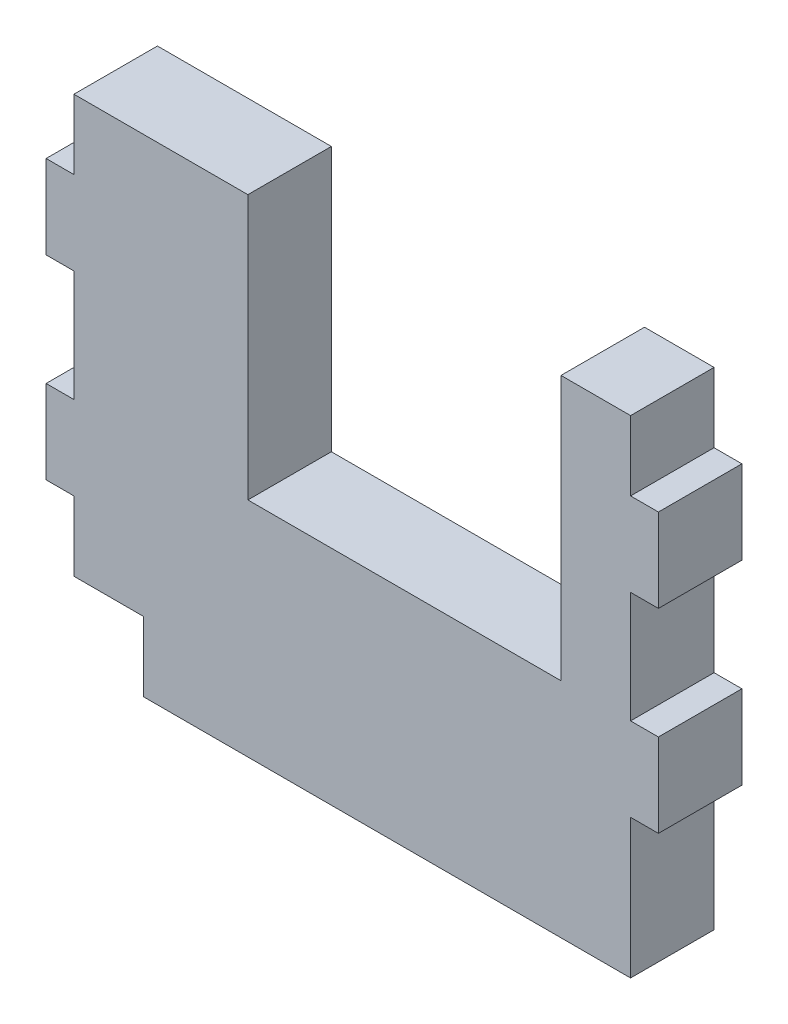
ISO-10303-21;
HEADER;
FILE_DESCRIPTION(('STEP AP214'),'2;1');
FILE_NAME('part.step','',(''),(''),'','','');
FILE_SCHEMA(('AUTOMOTIVE_DESIGN { 1 0 10303 214 1 1 1 1 }'));
ENDSEC;
DATA;
#1=APPLICATION_CONTEXT('core data for automotive mechanical design processes');
#2=APPLICATION_PROTOCOL_DEFINITION('international standard','automotive_design',2000,#1);
#3=PRODUCT_CONTEXT('',#1,'mechanical');
#4=PRODUCT('Part','Part','',(#3));
#5=PRODUCT_RELATED_PRODUCT_CATEGORY('part','',(#4));
#6=PRODUCT_DEFINITION_FORMATION('','',#4);
#7=PRODUCT_DEFINITION_CONTEXT('part definition',#1,'design');
#8=PRODUCT_DEFINITION('design','',#6,#7);
#9=PRODUCT_DEFINITION_SHAPE('','',#8);
#10=(LENGTH_UNIT() NAMED_UNIT(*) SI_UNIT(.MILLI.,.METRE.));
#11=(NAMED_UNIT(*) PLANE_ANGLE_UNIT() SI_UNIT($,.RADIAN.));
#12=(NAMED_UNIT(*) SI_UNIT($,.STERADIAN.) SOLID_ANGLE_UNIT());
#13=UNCERTAINTY_MEASURE_WITH_UNIT(LENGTH_MEASURE(1.E-05),#10,'distance_accuracy_value','');
#14=(GEOMETRIC_REPRESENTATION_CONTEXT(3) GLOBAL_UNCERTAINTY_ASSIGNED_CONTEXT((#13)) GLOBAL_UNIT_ASSIGNED_CONTEXT((#10,
#11,#12)) REPRESENTATION_CONTEXT('',''));
#15=CARTESIAN_POINT('',(0.,0.,0.));
#16=DIRECTION('',(0.,0.,1.));
#17=DIRECTION('',(1.,0.,0.));
#18=AXIS2_PLACEMENT_3D('',#15,#16,#17);
#19=CARTESIAN_POINT('',(40.,30.,6.));
#20=DIRECTION('',(-1.,0.,0.));
#21=DIRECTION('',(0.,-1.,0.));
#22=AXIS2_PLACEMENT_3D('',#19,#20,#21);
#23=PLANE('',#22);
#24=DIRECTION('',(0.,1.,0.));
#25=VECTOR('',#24,1.);
#26=CARTESIAN_POINT('',(40.,30.,0.));
#27=LINE('',#26,#25);
#28=CARTESIAN_POINT('',(40.,30.,0.));
#29=VERTEX_POINT('',#28);
#30=CARTESIAN_POINT('',(40.,35.,0.));
#31=VERTEX_POINT('',#30);
#32=EDGE_CURVE('E248',#29,#31,#27,.T.);
#33=ORIENTED_EDGE('',*,*,#32,.T.);
#34=DIRECTION('',(0.,0.,-1.));
#35=VECTOR('',#34,1.);
#36=CARTESIAN_POINT('',(40.,35.,6.));
#37=LINE('',#36,#35);
#38=CARTESIAN_POINT('',(40.,35.,6.));
#39=VERTEX_POINT('',#38);
#40=EDGE_CURVE('E11',#39,#31,#37,.T.);
#41=ORIENTED_EDGE('',*,*,#40,.F.);
#42=DIRECTION('',(0.,1.,0.));
#43=VECTOR('',#42,1.);
#44=CARTESIAN_POINT('',(40.,30.,6.));
#45=LINE('',#44,#43);
#46=CARTESIAN_POINT('',(40.,30.,6.));
#47=VERTEX_POINT('',#46);
#48=EDGE_CURVE('E324',#47,#39,#45,.T.);
#49=ORIENTED_EDGE('',*,*,#48,.F.);
#50=DIRECTION('',(0.,0.,-1.));
#51=VECTOR('',#50,1.);
#52=CARTESIAN_POINT('',(40.,30.,6.));
#53=LINE('',#52,#51);
#54=EDGE_CURVE('E244',#47,#29,#53,.T.);
#55=ORIENTED_EDGE('',*,*,#54,.T.);
#56=EDGE_LOOP('',(#33,#41,#49,#55));
#57=FACE_BOUND('',#56,.T.);
#58=ADVANCED_FACE('F39',(#57),#23,.F.);
#59=CARTESIAN_POINT('',(35.,35.,6.));
#60=DIRECTION('',(0.,-1.,0.));
#61=DIRECTION('',(0.,0.,-1.));
#62=AXIS2_PLACEMENT_3D('',#59,#60,#61);
#63=PLANE('',#62);
#64=DIRECTION('',(-1.,0.,0.));
#65=VECTOR('',#64,1.);
#66=CARTESIAN_POINT('',(35.,35.,0.));
#67=LINE('',#66,#65);
#68=CARTESIAN_POINT('',(35.,35.,0.));
#69=VERTEX_POINT('',#68);
#70=EDGE_CURVE('E252',#31,#69,#67,.T.);
#71=ORIENTED_EDGE('',*,*,#70,.T.);
#72=DIRECTION('',(0.,0.,-1.));
#73=VECTOR('',#72,1.);
#74=CARTESIAN_POINT('',(35.,35.,6.));
#75=LINE('',#74,#73);
#76=CARTESIAN_POINT('',(35.,35.,6.));
#77=VERTEX_POINT('',#76);
#78=EDGE_CURVE('E48',#77,#69,#75,.T.);
#79=ORIENTED_EDGE('',*,*,#78,.F.);
#80=DIRECTION('',(-1.,0.,0.));
#81=VECTOR('',#80,1.);
#82=CARTESIAN_POINT('',(35.,35.,6.));
#83=LINE('',#82,#81);
#84=EDGE_CURVE('E153',#39,#77,#83,.T.);
#85=ORIENTED_EDGE('',*,*,#84,.F.);
#86=ORIENTED_EDGE('',*,*,#40,.T.);
#87=EDGE_LOOP('',(#71,#79,#85,#86));
#88=FACE_BOUND('',#87,.T.);
#89=ADVANCED_FACE('F516',(#88),#63,.F.);
#90=CARTESIAN_POINT('',(35.,35.,6.));
#91=DIRECTION('',(1.,0.,0.));
#92=DIRECTION('',(0.,0.,-1.));
#93=AXIS2_PLACEMENT_3D('',#90,#91,#92);
#94=PLANE('',#93);
#95=DIRECTION('',(0.,-1.,0.));
#96=VECTOR('',#95,1.);
#97=CARTESIAN_POINT('',(35.,35.,0.));
#98=LINE('',#97,#96);
#99=CARTESIAN_POINT('',(35.,16.,0.));
#100=VERTEX_POINT('',#99);
#101=EDGE_CURVE('E255',#69,#100,#98,.T.);
#102=ORIENTED_EDGE('',*,*,#101,.T.);
#103=DIRECTION('',(0.,0.,-1.));
#104=VECTOR('',#103,1.);
#105=CARTESIAN_POINT('',(35.,16.,6.));
#106=LINE('',#105,#104);
#107=CARTESIAN_POINT('',(35.,16.,6.));
#108=VERTEX_POINT('',#107);
#109=EDGE_CURVE('E407',#108,#100,#106,.T.);
#110=ORIENTED_EDGE('',*,*,#109,.F.);
#111=DIRECTION('',(0.,-1.,0.));
#112=VECTOR('',#111,1.);
#113=CARTESIAN_POINT('',(35.,35.,6.));
#114=LINE('',#113,#112);
#115=EDGE_CURVE('E417',#77,#108,#114,.T.);
#116=ORIENTED_EDGE('',*,*,#115,.F.);
#117=ORIENTED_EDGE('',*,*,#78,.T.);
#118=EDGE_LOOP('',(#102,#110,#116,#117));
#119=FACE_BOUND('',#118,.T.);
#120=ADVANCED_FACE('F415',(#119),#94,.F.);
#121=CARTESIAN_POINT('',(12.5,16.,6.));
#122=DIRECTION('',(0.,-1.,0.));
#123=DIRECTION('',(0.,0.,-1.));
#124=AXIS2_PLACEMENT_3D('',#121,#122,#123);
#125=PLANE('',#124);
#126=DIRECTION('',(-1.,0.,0.));
#127=VECTOR('',#126,1.);
#128=CARTESIAN_POINT('',(12.5,16.,0.));
#129=LINE('',#128,#127);
#130=CARTESIAN_POINT('',(12.5,16.,0.));
#131=VERTEX_POINT('',#130);
#132=EDGE_CURVE('E258',#100,#131,#129,.T.);
#133=ORIENTED_EDGE('',*,*,#132,.T.);
#134=DIRECTION('',(0.,0.,-1.));
#135=VECTOR('',#134,1.);
#136=CARTESIAN_POINT('',(12.5,16.,6.));
#137=LINE('',#136,#135);
#138=CARTESIAN_POINT('',(12.5,16.,6.));
#139=VERTEX_POINT('',#138);
#140=EDGE_CURVE('E403',#139,#131,#137,.T.);
#141=ORIENTED_EDGE('',*,*,#140,.F.);
#142=DIRECTION('',(-1.,0.,0.));
#143=VECTOR('',#142,1.);
#144=CARTESIAN_POINT('',(12.5,16.,6.));
#145=LINE('',#144,#143);
#146=EDGE_CURVE('E436',#108,#139,#145,.T.);
#147=ORIENTED_EDGE('',*,*,#146,.F.);
#148=ORIENTED_EDGE('',*,*,#109,.T.);
#149=EDGE_LOOP('',(#133,#141,#147,#148));
#150=FACE_BOUND('',#149,.T.);
#151=ADVANCED_FACE('F426',(#150),#125,.F.);
#152=CARTESIAN_POINT('',(12.5,35.,6.));
#153=DIRECTION('',(-1.,0.,0.));
#154=DIRECTION('',(0.,-1.,0.));
#155=AXIS2_PLACEMENT_3D('',#152,#153,#154);
#156=PLANE('',#155);
#157=DIRECTION('',(0.,1.,0.));
#158=VECTOR('',#157,1.);
#159=CARTESIAN_POINT('',(12.5,35.,0.));
#160=LINE('',#159,#158);
#161=CARTESIAN_POINT('',(12.5,35.,0.));
#162=VERTEX_POINT('',#161);
#163=EDGE_CURVE('E261',#131,#162,#160,.T.);
#164=ORIENTED_EDGE('',*,*,#163,.T.);
#165=DIRECTION('',(0.,0.,-1.));
#166=VECTOR('',#165,1.);
#167=CARTESIAN_POINT('',(12.5,35.,6.));
#168=LINE('',#167,#166);
#169=CARTESIAN_POINT('',(12.5,35.,6.));
#170=VERTEX_POINT('',#169);
#171=EDGE_CURVE('E399',#170,#162,#168,.T.);
#172=ORIENTED_EDGE('',*,*,#171,.F.);
#173=DIRECTION('',(0.,1.,0.));
#174=VECTOR('',#173,1.);
#175=CARTESIAN_POINT('',(12.5,35.,6.));
#176=LINE('',#175,#174);
#177=EDGE_CURVE('E432',#139,#170,#176,.T.);
#178=ORIENTED_EDGE('',*,*,#177,.F.);
#179=ORIENTED_EDGE('',*,*,#140,.T.);
#180=EDGE_LOOP('',(#164,#172,#178,#179));
#181=FACE_BOUND('',#180,.T.);
#182=ADVANCED_FACE('F430',(#181),#156,.F.);
#183=CARTESIAN_POINT('',(0.,35.,6.));
#184=DIRECTION('',(0.,-1.,0.));
#185=DIRECTION('',(0.,0.,-1.));
#186=AXIS2_PLACEMENT_3D('',#183,#184,#185);
#187=PLANE('',#186);
#188=DIRECTION('',(-1.,0.,0.));
#189=VECTOR('',#188,1.);
#190=CARTESIAN_POINT('',(0.,35.,0.));
#191=LINE('',#190,#189);
#192=CARTESIAN_POINT('',(0.,35.,0.));
#193=VERTEX_POINT('',#192);
#194=EDGE_CURVE('E264',#162,#193,#191,.T.);
#195=ORIENTED_EDGE('',*,*,#194,.T.);
#196=DIRECTION('',(0.,0.,-1.));
#197=VECTOR('',#196,1.);
#198=CARTESIAN_POINT('',(0.,35.,6.));
#199=LINE('',#198,#197);
#200=CARTESIAN_POINT('',(0.,35.,6.));
#201=VERTEX_POINT('',#200);
#202=EDGE_CURVE('E395',#201,#193,#199,.T.);
#203=ORIENTED_EDGE('',*,*,#202,.F.);
#204=DIRECTION('',(-1.,0.,0.));
#205=VECTOR('',#204,1.);
#206=CARTESIAN_POINT('',(0.,35.,6.));
#207=LINE('',#206,#205);
#208=EDGE_CURVE('E435',#170,#201,#207,.T.);
#209=ORIENTED_EDGE('',*,*,#208,.F.);
#210=ORIENTED_EDGE('',*,*,#171,.T.);
#211=EDGE_LOOP('',(#195,#203,#209,#210));
#212=FACE_BOUND('',#211,.T.);
#213=ADVANCED_FACE('F529',(#212),#187,.F.);
#214=CARTESIAN_POINT('',(0.,30.,6.));
#215=DIRECTION('',(1.,0.,0.));
#216=DIRECTION('',(0.,1.,0.));
#217=AXIS2_PLACEMENT_3D('',#214,#215,#216);
#218=PLANE('',#217);
#219=DIRECTION('',(0.,-1.,0.));
#220=VECTOR('',#219,1.);
#221=CARTESIAN_POINT('',(0.,30.,0.));
#222=LINE('',#221,#220);
#223=CARTESIAN_POINT('',(0.,30.,0.));
#224=VERTEX_POINT('',#223);
#225=EDGE_CURVE('E267',#193,#224,#222,.T.);
#226=ORIENTED_EDGE('',*,*,#225,.T.);
#227=DIRECTION('',(0.,0.,-1.));
#228=VECTOR('',#227,1.);
#229=CARTESIAN_POINT('',(0.,30.,6.));
#230=LINE('',#229,#228);
#231=CARTESIAN_POINT('',(0.,30.,6.));
#232=VERTEX_POINT('',#231);
#233=EDGE_CURVE('E391',#232,#224,#230,.T.);
#234=ORIENTED_EDGE('',*,*,#233,.F.);
#235=DIRECTION('',(0.,-1.,0.));
#236=VECTOR('',#235,1.);
#237=CARTESIAN_POINT('',(0.,30.,6.));
#238=LINE('',#237,#236);
#239=EDGE_CURVE('E440',#201,#232,#238,.T.);
#240=ORIENTED_EDGE('',*,*,#239,.F.);
#241=ORIENTED_EDGE('',*,*,#202,.T.);
#242=EDGE_LOOP('',(#226,#234,#240,#241));
#243=FACE_BOUND('',#242,.T.);
#244=ADVANCED_FACE('F532',(#243),#218,.F.);
#245=CARTESIAN_POINT('',(-2.,30.,6.));
#246=DIRECTION('',(0.,-1.,0.));
#247=DIRECTION('',(0.,0.,-1.));
#248=AXIS2_PLACEMENT_3D('',#245,#246,#247);
#249=PLANE('',#248);
#250=DIRECTION('',(-1.,0.,0.));
#251=VECTOR('',#250,1.);
#252=CARTESIAN_POINT('',(-2.,30.,0.));
#253=LINE('',#252,#251);
#254=CARTESIAN_POINT('',(-2.,30.,0.));
#255=VERTEX_POINT('',#254);
#256=EDGE_CURVE('E270',#224,#255,#253,.T.);
#257=ORIENTED_EDGE('',*,*,#256,.T.);
#258=DIRECTION('',(0.,0.,-1.));
#259=VECTOR('',#258,1.);
#260=CARTESIAN_POINT('',(-2.,30.,6.));
#261=LINE('',#260,#259);
#262=CARTESIAN_POINT('',(-2.,30.,6.));
#263=VERTEX_POINT('',#262);
#264=EDGE_CURVE('E387',#263,#255,#261,.T.);
#265=ORIENTED_EDGE('',*,*,#264,.F.);
#266=DIRECTION('',(-1.,0.,0.));
#267=VECTOR('',#266,1.);
#268=CARTESIAN_POINT('',(-2.,30.,6.));
#269=LINE('',#268,#267);
#270=EDGE_CURVE('E447',#232,#263,#269,.T.);
#271=ORIENTED_EDGE('',*,*,#270,.F.);
#272=ORIENTED_EDGE('',*,*,#233,.T.);
#273=EDGE_LOOP('',(#257,#265,#271,#272));
#274=FACE_BOUND('',#273,.T.);
#275=ADVANCED_FACE('F536',(#274),#249,.F.);
#276=CARTESIAN_POINT('',(-2.,30.,6.));
#277=DIRECTION('',(1.,0.,0.));
#278=DIRECTION('',(0.,0.,-1.));
#279=AXIS2_PLACEMENT_3D('',#276,#277,#278);
#280=PLANE('',#279);
#281=DIRECTION('',(0.,-1.,0.));
#282=VECTOR('',#281,1.);
#283=CARTESIAN_POINT('',(-2.,30.,0.));
#284=LINE('',#283,#282);
#285=CARTESIAN_POINT('',(-2.,24.,0.));
#286=VERTEX_POINT('',#285);
#287=EDGE_CURVE('E273',#255,#286,#284,.T.);
#288=ORIENTED_EDGE('',*,*,#287,.T.);
#289=DIRECTION('',(0.,0.,-1.));
#290=VECTOR('',#289,1.);
#291=CARTESIAN_POINT('',(-2.,24.,6.));
#292=LINE('',#291,#290);
#293=CARTESIAN_POINT('',(-2.,24.,6.));
#294=VERTEX_POINT('',#293);
#295=EDGE_CURVE('E383',#294,#286,#292,.T.);
#296=ORIENTED_EDGE('',*,*,#295,.F.);
#297=DIRECTION('',(0.,-1.,0.));
#298=VECTOR('',#297,1.);
#299=CARTESIAN_POINT('',(-2.,30.,6.));
#300=LINE('',#299,#298);
#301=EDGE_CURVE('E450',#263,#294,#300,.T.);
#302=ORIENTED_EDGE('',*,*,#301,.F.);
#303=ORIENTED_EDGE('',*,*,#264,.T.);
#304=EDGE_LOOP('',(#288,#296,#302,#303));
#305=FACE_BOUND('',#304,.T.);
#306=ADVANCED_FACE('F540',(#305),#280,.F.);
#307=CARTESIAN_POINT('',(-2.,24.,6.));
#308=DIRECTION('',(0.,1.,0.));
#309=DIRECTION('',(0.,0.,1.));
#310=AXIS2_PLACEMENT_3D('',#307,#308,#309);
#311=PLANE('',#310);
#312=DIRECTION('',(1.,0.,0.));
#313=VECTOR('',#312,1.);
#314=CARTESIAN_POINT('',(-2.,24.,0.));
#315=LINE('',#314,#313);
#316=CARTESIAN_POINT('',(0.,24.,0.));
#317=VERTEX_POINT('',#316);
#318=EDGE_CURVE('E276',#286,#317,#315,.T.);
#319=ORIENTED_EDGE('',*,*,#318,.T.);
#320=DIRECTION('',(0.,0.,-1.));
#321=VECTOR('',#320,1.);
#322=CARTESIAN_POINT('',(0.,24.,6.));
#323=LINE('',#322,#321);
#324=CARTESIAN_POINT('',(0.,24.,6.));
#325=VERTEX_POINT('',#324);
#326=EDGE_CURVE('E379',#325,#317,#323,.T.);
#327=ORIENTED_EDGE('',*,*,#326,.F.);
#328=DIRECTION('',(1.,0.,0.));
#329=VECTOR('',#328,1.);
#330=CARTESIAN_POINT('',(-2.,24.,6.));
#331=LINE('',#330,#329);
#332=EDGE_CURVE('E453',#294,#325,#331,.T.);
#333=ORIENTED_EDGE('',*,*,#332,.F.);
#334=ORIENTED_EDGE('',*,*,#295,.T.);
#335=EDGE_LOOP('',(#319,#327,#333,#334));
#336=FACE_BOUND('',#335,.T.);
#337=ADVANCED_FACE('F544',(#336),#311,.F.);
#338=CARTESIAN_POINT('',(0.,16.,6.));
#339=DIRECTION('',(1.,0.,0.));
#340=DIRECTION('',(0.,0.,-1.));
#341=AXIS2_PLACEMENT_3D('',#338,#339,#340);
#342=PLANE('',#341);
#343=DIRECTION('',(0.,-1.,0.));
#344=VECTOR('',#343,1.);
#345=CARTESIAN_POINT('',(0.,16.,0.));
#346=LINE('',#345,#344);
#347=CARTESIAN_POINT('',(0.,16.,0.));
#348=VERTEX_POINT('',#347);
#349=EDGE_CURVE('E279',#317,#348,#346,.T.);
#350=ORIENTED_EDGE('',*,*,#349,.T.);
#351=DIRECTION('',(0.,0.,-1.));
#352=VECTOR('',#351,1.);
#353=CARTESIAN_POINT('',(0.,16.,6.));
#354=LINE('',#353,#352);
#355=CARTESIAN_POINT('',(0.,16.,6.));
#356=VERTEX_POINT('',#355);
#357=EDGE_CURVE('E375',#356,#348,#354,.T.);
#358=ORIENTED_EDGE('',*,*,#357,.F.);
#359=DIRECTION('',(0.,-1.,0.));
#360=VECTOR('',#359,1.);
#361=CARTESIAN_POINT('',(0.,16.,6.));
#362=LINE('',#361,#360);
#363=EDGE_CURVE('E456',#325,#356,#362,.T.);
#364=ORIENTED_EDGE('',*,*,#363,.F.);
#365=ORIENTED_EDGE('',*,*,#326,.T.);
#366=EDGE_LOOP('',(#350,#358,#364,#365));
#367=FACE_BOUND('',#366,.T.);
#368=ADVANCED_FACE('F548',(#367),#342,.F.);
#369=CARTESIAN_POINT('',(-2.,16.,6.));
#370=DIRECTION('',(0.,-1.,0.));
#371=DIRECTION('',(0.,0.,-1.));
#372=AXIS2_PLACEMENT_3D('',#369,#370,#371);
#373=PLANE('',#372);
#374=DIRECTION('',(-1.,0.,0.));
#375=VECTOR('',#374,1.);
#376=CARTESIAN_POINT('',(-2.,16.,0.));
#377=LINE('',#376,#375);
#378=CARTESIAN_POINT('',(-2.,16.,0.));
#379=VERTEX_POINT('',#378);
#380=EDGE_CURVE('E282',#348,#379,#377,.T.);
#381=ORIENTED_EDGE('',*,*,#380,.T.);
#382=DIRECTION('',(0.,0.,-1.));
#383=VECTOR('',#382,1.);
#384=CARTESIAN_POINT('',(-2.,16.,6.));
#385=LINE('',#384,#383);
#386=CARTESIAN_POINT('',(-2.,16.,6.));
#387=VERTEX_POINT('',#386);
#388=EDGE_CURVE('E371',#387,#379,#385,.T.);
#389=ORIENTED_EDGE('',*,*,#388,.F.);
#390=DIRECTION('',(-1.,0.,0.));
#391=VECTOR('',#390,1.);
#392=CARTESIAN_POINT('',(-2.,16.,6.));
#393=LINE('',#392,#391);
#394=EDGE_CURVE('E459',#356,#387,#393,.T.);
#395=ORIENTED_EDGE('',*,*,#394,.F.);
#396=ORIENTED_EDGE('',*,*,#357,.T.);
#397=EDGE_LOOP('',(#381,#389,#395,#396));
#398=FACE_BOUND('',#397,.T.);
#399=ADVANCED_FACE('F552',(#398),#373,.F.);
#400=CARTESIAN_POINT('',(-2.,16.,6.));
#401=DIRECTION('',(1.,0.,0.));
#402=DIRECTION('',(0.,0.,-1.));
#403=AXIS2_PLACEMENT_3D('',#400,#401,#402);
#404=PLANE('',#403);
#405=DIRECTION('',(0.,-1.,0.));
#406=VECTOR('',#405,1.);
#407=CARTESIAN_POINT('',(-2.,16.,0.));
#408=LINE('',#407,#406);
#409=CARTESIAN_POINT('',(-2.,10.,0.));
#410=VERTEX_POINT('',#409);
#411=EDGE_CURVE('E285',#379,#410,#408,.T.);
#412=ORIENTED_EDGE('',*,*,#411,.T.);
#413=DIRECTION('',(0.,0.,-1.));
#414=VECTOR('',#413,1.);
#415=CARTESIAN_POINT('',(-2.,10.,6.));
#416=LINE('',#415,#414);
#417=CARTESIAN_POINT('',(-2.,10.,6.));
#418=VERTEX_POINT('',#417);
#419=EDGE_CURVE('E367',#418,#410,#416,.T.);
#420=ORIENTED_EDGE('',*,*,#419,.F.);
#421=DIRECTION('',(0.,-1.,0.));
#422=VECTOR('',#421,1.);
#423=CARTESIAN_POINT('',(-2.,16.,6.));
#424=LINE('',#423,#422);
#425=EDGE_CURVE('E462',#387,#418,#424,.T.);
#426=ORIENTED_EDGE('',*,*,#425,.F.);
#427=ORIENTED_EDGE('',*,*,#388,.T.);
#428=EDGE_LOOP('',(#412,#420,#426,#427));
#429=FACE_BOUND('',#428,.T.);
#430=ADVANCED_FACE('F556',(#429),#404,.F.);
#431=CARTESIAN_POINT('',(-2.,10.,6.));
#432=DIRECTION('',(0.,1.,0.));
#433=DIRECTION('',(0.,0.,1.));
#434=AXIS2_PLACEMENT_3D('',#431,#432,#433);
#435=PLANE('',#434);
#436=DIRECTION('',(1.,0.,0.));
#437=VECTOR('',#436,1.);
#438=CARTESIAN_POINT('',(-2.,10.,0.));
#439=LINE('',#438,#437);
#440=CARTESIAN_POINT('',(0.,10.,0.));
#441=VERTEX_POINT('',#440);
#442=EDGE_CURVE('E288',#410,#441,#439,.T.);
#443=ORIENTED_EDGE('',*,*,#442,.T.);
#444=DIRECTION('',(0.,0.,-1.));
#445=VECTOR('',#444,1.);
#446=CARTESIAN_POINT('',(0.,10.,6.));
#447=LINE('',#446,#445);
#448=CARTESIAN_POINT('',(0.,10.,6.));
#449=VERTEX_POINT('',#448);
#450=EDGE_CURVE('E363',#449,#441,#447,.T.);
#451=ORIENTED_EDGE('',*,*,#450,.F.);
#452=DIRECTION('',(1.,0.,0.));
#453=VECTOR('',#452,1.);
#454=CARTESIAN_POINT('',(-2.,10.,6.));
#455=LINE('',#454,#453);
#456=EDGE_CURVE('E465',#418,#449,#455,.T.);
#457=ORIENTED_EDGE('',*,*,#456,.F.);
#458=ORIENTED_EDGE('',*,*,#419,.T.);
#459=EDGE_LOOP('',(#443,#451,#457,#458));
#460=FACE_BOUND('',#459,.T.);
#461=ADVANCED_FACE('F560',(#460),#435,.F.);
#462=CARTESIAN_POINT('',(0.,5.,6.));
#463=DIRECTION('',(1.,0.,0.));
#464=DIRECTION('',(0.,0.,-1.));
#465=AXIS2_PLACEMENT_3D('',#462,#463,#464);
#466=PLANE('',#465);
#467=DIRECTION('',(0.,-1.,0.));
#468=VECTOR('',#467,1.);
#469=CARTESIAN_POINT('',(0.,5.,0.));
#470=LINE('',#469,#468);
#471=CARTESIAN_POINT('',(0.,5.,0.));
#472=VERTEX_POINT('',#471);
#473=EDGE_CURVE('E291',#441,#472,#470,.T.);
#474=ORIENTED_EDGE('',*,*,#473,.T.);
#475=DIRECTION('',(0.,0.,-1.));
#476=VECTOR('',#475,1.);
#477=CARTESIAN_POINT('',(0.,5.,6.));
#478=LINE('',#477,#476);
#479=CARTESIAN_POINT('',(0.,5.,6.));
#480=VERTEX_POINT('',#479);
#481=EDGE_CURVE('E359',#480,#472,#478,.T.);
#482=ORIENTED_EDGE('',*,*,#481,.F.);
#483=DIRECTION('',(0.,-1.,0.));
#484=VECTOR('',#483,1.);
#485=CARTESIAN_POINT('',(0.,5.,6.));
#486=LINE('',#485,#484);
#487=EDGE_CURVE('E468',#449,#480,#486,.T.);
#488=ORIENTED_EDGE('',*,*,#487,.F.);
#489=ORIENTED_EDGE('',*,*,#450,.T.);
#490=EDGE_LOOP('',(#474,#482,#488,#489));
#491=FACE_BOUND('',#490,.T.);
#492=ADVANCED_FACE('F564',(#491),#466,.F.);
#493=CARTESIAN_POINT('',(0.,5.,6.));
#494=DIRECTION('',(0.,1.,0.));
#495=DIRECTION('',(0.,0.,1.));
#496=AXIS2_PLACEMENT_3D('',#493,#494,#495);
#497=PLANE('',#496);
#498=DIRECTION('',(1.,0.,0.));
#499=VECTOR('',#498,1.);
#500=CARTESIAN_POINT('',(0.,5.,0.));
#501=LINE('',#500,#499);
#502=CARTESIAN_POINT('',(5.,5.,0.));
#503=VERTEX_POINT('',#502);
#504=EDGE_CURVE('E294',#472,#503,#501,.T.);
#505=ORIENTED_EDGE('',*,*,#504,.T.);
#506=DIRECTION('',(0.,0.,-1.));
#507=VECTOR('',#506,1.);
#508=CARTESIAN_POINT('',(5.,5.,6.));
#509=LINE('',#508,#507);
#510=CARTESIAN_POINT('',(5.,5.,6.));
#511=VERTEX_POINT('',#510);
#512=EDGE_CURVE('E355',#511,#503,#509,.T.);
#513=ORIENTED_EDGE('',*,*,#512,.F.);
#514=DIRECTION('',(1.,0.,0.));
#515=VECTOR('',#514,1.);
#516=CARTESIAN_POINT('',(0.,5.,6.));
#517=LINE('',#516,#515);
#518=EDGE_CURVE('E471',#480,#511,#517,.T.);
#519=ORIENTED_EDGE('',*,*,#518,.F.);
#520=ORIENTED_EDGE('',*,*,#481,.T.);
#521=EDGE_LOOP('',(#505,#513,#519,#520));
#522=FACE_BOUND('',#521,.T.);
#523=ADVANCED_FACE('F568',(#522),#497,.F.);
#524=CARTESIAN_POINT('',(5.,0.,6.));
#525=DIRECTION('',(1.,0.,0.));
#526=DIRECTION('',(0.,0.,-1.));
#527=AXIS2_PLACEMENT_3D('',#524,#525,#526);
#528=PLANE('',#527);
#529=DIRECTION('',(0.,-1.,0.));
#530=VECTOR('',#529,1.);
#531=CARTESIAN_POINT('',(5.,0.,0.));
#532=LINE('',#531,#530);
#533=CARTESIAN_POINT('',(5.,0.,0.));
#534=VERTEX_POINT('',#533);
#535=EDGE_CURVE('E297',#503,#534,#532,.T.);
#536=ORIENTED_EDGE('',*,*,#535,.T.);
#537=DIRECTION('',(0.,0.,-1.));
#538=VECTOR('',#537,1.);
#539=CARTESIAN_POINT('',(5.,0.,6.));
#540=LINE('',#539,#538);
#541=CARTESIAN_POINT('',(5.,0.,6.));
#542=VERTEX_POINT('',#541);
#543=EDGE_CURVE('E351',#542,#534,#540,.T.);
#544=ORIENTED_EDGE('',*,*,#543,.F.);
#545=DIRECTION('',(0.,-1.,0.));
#546=VECTOR('',#545,1.);
#547=CARTESIAN_POINT('',(5.,0.,6.));
#548=LINE('',#547,#546);
#549=EDGE_CURVE('E474',#511,#542,#548,.T.);
#550=ORIENTED_EDGE('',*,*,#549,.F.);
#551=ORIENTED_EDGE('',*,*,#512,.T.);
#552=EDGE_LOOP('',(#536,#544,#550,#551));
#553=FACE_BOUND('',#552,.T.);
#554=ADVANCED_FACE('F572',(#553),#528,.F.);
#555=CARTESIAN_POINT('',(5.,0.,6.));
#556=DIRECTION('',(0.,1.,0.));
#557=DIRECTION('',(0.,0.,1.));
#558=AXIS2_PLACEMENT_3D('',#555,#556,#557);
#559=PLANE('',#558);
#560=DIRECTION('',(1.,0.,0.));
#561=VECTOR('',#560,1.);
#562=CARTESIAN_POINT('',(5.,0.,0.));
#563=LINE('',#562,#561);
#564=CARTESIAN_POINT('',(40.,0.,0.));
#565=VERTEX_POINT('',#564);
#566=EDGE_CURVE('E300',#534,#565,#563,.T.);
#567=ORIENTED_EDGE('',*,*,#566,.T.);
#568=DIRECTION('',(0.,0.,-1.));
#569=VECTOR('',#568,1.);
#570=CARTESIAN_POINT('',(40.,0.,6.));
#571=LINE('',#570,#569);
#572=CARTESIAN_POINT('',(40.,0.,6.));
#573=VERTEX_POINT('',#572);
#574=EDGE_CURVE('E347',#573,#565,#571,.T.);
#575=ORIENTED_EDGE('',*,*,#574,.F.);
#576=DIRECTION('',(1.,0.,0.));
#577=VECTOR('',#576,1.);
#578=CARTESIAN_POINT('',(5.,0.,6.));
#579=LINE('',#578,#577);
#580=EDGE_CURVE('E477',#542,#573,#579,.T.);
#581=ORIENTED_EDGE('',*,*,#580,.F.);
#582=ORIENTED_EDGE('',*,*,#543,.T.);
#583=EDGE_LOOP('',(#567,#575,#581,#582));
#584=FACE_BOUND('',#583,.T.);
#585=ADVANCED_FACE('F576',(#584),#559,.F.);
#586=CARTESIAN_POINT('',(40.,0.,6.));
#587=DIRECTION('',(-1.,0.,0.));
#588=DIRECTION('',(0.,0.,1.));
#589=AXIS2_PLACEMENT_3D('',#586,#587,#588);
#590=PLANE('',#589);
#591=DIRECTION('',(0.,1.,0.));
#592=VECTOR('',#591,1.);
#593=CARTESIAN_POINT('',(40.,0.,0.));
#594=LINE('',#593,#592);
#595=CARTESIAN_POINT('',(40.,10.,0.));
#596=VERTEX_POINT('',#595);
#597=EDGE_CURVE('E303',#565,#596,#594,.T.);
#598=ORIENTED_EDGE('',*,*,#597,.T.);
#599=DIRECTION('',(0.,0.,-1.));
#600=VECTOR('',#599,1.);
#601=CARTESIAN_POINT('',(40.,10.,6.));
#602=LINE('',#601,#600);
#603=CARTESIAN_POINT('',(40.,10.,6.));
#604=VERTEX_POINT('',#603);
#605=EDGE_CURVE('E343',#604,#596,#602,.T.);
#606=ORIENTED_EDGE('',*,*,#605,.F.);
#607=DIRECTION('',(0.,1.,0.));
#608=VECTOR('',#607,1.);
#609=CARTESIAN_POINT('',(40.,0.,6.));
#610=LINE('',#609,#608);
#611=EDGE_CURVE('E480',#573,#604,#610,.T.);
#612=ORIENTED_EDGE('',*,*,#611,.F.);
#613=ORIENTED_EDGE('',*,*,#574,.T.);
#614=EDGE_LOOP('',(#598,#606,#612,#613));
#615=FACE_BOUND('',#614,.T.);
#616=ADVANCED_FACE('F580',(#615),#590,.F.);
#617=CARTESIAN_POINT('',(40.,10.,6.));
#618=DIRECTION('',(0.,1.,0.));
#619=DIRECTION('',(0.,0.,1.));
#620=AXIS2_PLACEMENT_3D('',#617,#618,#619);
#621=PLANE('',#620);
#622=DIRECTION('',(1.,0.,0.));
#623=VECTOR('',#622,1.);
#624=CARTESIAN_POINT('',(40.,10.,0.));
#625=LINE('',#624,#623);
#626=CARTESIAN_POINT('',(42.,10.,0.));
#627=VERTEX_POINT('',#626);
#628=EDGE_CURVE('E306',#596,#627,#625,.T.);
#629=ORIENTED_EDGE('',*,*,#628,.T.);
#630=DIRECTION('',(0.,0.,-1.));
#631=VECTOR('',#630,1.);
#632=CARTESIAN_POINT('',(42.,10.,6.));
#633=LINE('',#632,#631);
#634=CARTESIAN_POINT('',(42.,10.,6.));
#635=VERTEX_POINT('',#634);
#636=EDGE_CURVE('E339',#635,#627,#633,.T.);
#637=ORIENTED_EDGE('',*,*,#636,.F.);
#638=DIRECTION('',(1.,0.,0.));
#639=VECTOR('',#638,1.);
#640=CARTESIAN_POINT('',(40.,10.,6.));
#641=LINE('',#640,#639);
#642=EDGE_CURVE('E483',#604,#635,#641,.T.);
#643=ORIENTED_EDGE('',*,*,#642,.F.);
#644=ORIENTED_EDGE('',*,*,#605,.T.);
#645=EDGE_LOOP('',(#629,#637,#643,#644));
#646=FACE_BOUND('',#645,.T.);
#647=ADVANCED_FACE('F584',(#646),#621,.F.);
#648=CARTESIAN_POINT('',(42.,16.,6.));
#649=DIRECTION('',(-1.,0.,0.));
#650=DIRECTION('',(0.,0.,1.));
#651=AXIS2_PLACEMENT_3D('',#648,#649,#650);
#652=PLANE('',#651);
#653=DIRECTION('',(0.,1.,0.));
#654=VECTOR('',#653,1.);
#655=CARTESIAN_POINT('',(42.,16.,0.));
#656=LINE('',#655,#654);
#657=CARTESIAN_POINT('',(42.,16.,0.));
#658=VERTEX_POINT('',#657);
#659=EDGE_CURVE('E309',#627,#658,#656,.T.);
#660=ORIENTED_EDGE('',*,*,#659,.T.);
#661=DIRECTION('',(0.,0.,-1.));
#662=VECTOR('',#661,1.);
#663=CARTESIAN_POINT('',(42.,16.,6.));
#664=LINE('',#663,#662);
#665=CARTESIAN_POINT('',(42.,16.,6.));
#666=VERTEX_POINT('',#665);
#667=EDGE_CURVE('E335',#666,#658,#664,.T.);
#668=ORIENTED_EDGE('',*,*,#667,.F.);
#669=DIRECTION('',(0.,1.,0.));
#670=VECTOR('',#669,1.);
#671=CARTESIAN_POINT('',(42.,16.,6.));
#672=LINE('',#671,#670);
#673=EDGE_CURVE('E486',#635,#666,#672,.T.);
#674=ORIENTED_EDGE('',*,*,#673,.F.);
#675=ORIENTED_EDGE('',*,*,#636,.T.);
#676=EDGE_LOOP('',(#660,#668,#674,#675));
#677=FACE_BOUND('',#676,.T.);
#678=ADVANCED_FACE('F588',(#677),#652,.F.);
#679=CARTESIAN_POINT('',(40.,16.,6.));
#680=DIRECTION('',(0.,-1.,0.));
#681=DIRECTION('',(0.,0.,-1.));
#682=AXIS2_PLACEMENT_3D('',#679,#680,#681);
#683=PLANE('',#682);
#684=DIRECTION('',(-1.,0.,0.));
#685=VECTOR('',#684,1.);
#686=CARTESIAN_POINT('',(40.,16.,0.));
#687=LINE('',#686,#685);
#688=CARTESIAN_POINT('',(40.,16.,0.));
#689=VERTEX_POINT('',#688);
#690=EDGE_CURVE('E312',#658,#689,#687,.T.);
#691=ORIENTED_EDGE('',*,*,#690,.T.);
#692=DIRECTION('',(0.,0.,-1.));
#693=VECTOR('',#692,1.);
#694=CARTESIAN_POINT('',(40.,16.,6.));
#695=LINE('',#694,#693);
#696=CARTESIAN_POINT('',(40.,16.,6.));
#697=VERTEX_POINT('',#696);
#698=EDGE_CURVE('E331',#697,#689,#695,.T.);
#699=ORIENTED_EDGE('',*,*,#698,.F.);
#700=DIRECTION('',(-1.,0.,0.));
#701=VECTOR('',#700,1.);
#702=CARTESIAN_POINT('',(40.,16.,6.));
#703=LINE('',#702,#701);
#704=EDGE_CURVE('E489',#666,#697,#703,.T.);
#705=ORIENTED_EDGE('',*,*,#704,.F.);
#706=ORIENTED_EDGE('',*,*,#667,.T.);
#707=EDGE_LOOP('',(#691,#699,#705,#706));
#708=FACE_BOUND('',#707,.T.);
#709=ADVANCED_FACE('F497',(#708),#683,.F.);
#710=CARTESIAN_POINT('',(40.,16.,6.));
#711=DIRECTION('',(-1.,0.,0.));
#712=DIRECTION('',(0.,0.,1.));
#713=AXIS2_PLACEMENT_3D('',#710,#711,#712);
#714=PLANE('',#713);
#715=DIRECTION('',(0.,1.,0.));
#716=VECTOR('',#715,1.);
#717=CARTESIAN_POINT('',(40.,16.,0.));
#718=LINE('',#717,#716);
#719=CARTESIAN_POINT('',(40.,24.,0.));
#720=VERTEX_POINT('',#719);
#721=EDGE_CURVE('E315',#689,#720,#718,.T.);
#722=ORIENTED_EDGE('',*,*,#721,.T.);
#723=DIRECTION('',(0.,0.,-1.));
#724=VECTOR('',#723,1.);
#725=CARTESIAN_POINT('',(40.,24.,6.));
#726=LINE('',#725,#724);
#727=CARTESIAN_POINT('',(40.,24.,6.));
#728=VERTEX_POINT('',#727);
#729=EDGE_CURVE('E237',#728,#720,#726,.T.);
#730=ORIENTED_EDGE('',*,*,#729,.F.);
#731=DIRECTION('',(0.,1.,0.));
#732=VECTOR('',#731,1.);
#733=CARTESIAN_POINT('',(40.,16.,6.));
#734=LINE('',#733,#732);
#735=EDGE_CURVE('E226',#697,#728,#734,.T.);
#736=ORIENTED_EDGE('',*,*,#735,.F.);
#737=ORIENTED_EDGE('',*,*,#698,.T.);
#738=EDGE_LOOP('',(#722,#730,#736,#737));
#739=FACE_BOUND('',#738,.T.);
#740=ADVANCED_FACE('F501',(#739),#714,.F.);
#741=CARTESIAN_POINT('',(40.,24.,6.));
#742=DIRECTION('',(0.,1.,0.));
#743=DIRECTION('',(0.,0.,1.));
#744=AXIS2_PLACEMENT_3D('',#741,#742,#743);
#745=PLANE('',#744);
#746=DIRECTION('',(1.,0.,0.));
#747=VECTOR('',#746,1.);
#748=CARTESIAN_POINT('',(40.,24.,0.));
#749=LINE('',#748,#747);
#750=CARTESIAN_POINT('',(42.,24.,0.));
#751=VERTEX_POINT('',#750);
#752=EDGE_CURVE('E235',#720,#751,#749,.T.);
#753=ORIENTED_EDGE('',*,*,#752,.T.);
#754=DIRECTION('',(0.,0.,-1.));
#755=VECTOR('',#754,1.);
#756=CARTESIAN_POINT('',(42.,24.,6.));
#757=LINE('',#756,#755);
#758=CARTESIAN_POINT('',(42.,24.,6.));
#759=VERTEX_POINT('',#758);
#760=EDGE_CURVE('E232',#759,#751,#757,.T.);
#761=ORIENTED_EDGE('',*,*,#760,.F.);
#762=DIRECTION('',(1.,0.,0.));
#763=VECTOR('',#762,1.);
#764=CARTESIAN_POINT('',(40.,24.,6.));
#765=LINE('',#764,#763);
#766=EDGE_CURVE('E220',#728,#759,#765,.T.);
#767=ORIENTED_EDGE('',*,*,#766,.F.);
#768=ORIENTED_EDGE('',*,*,#729,.T.);
#769=EDGE_LOOP('',(#753,#761,#767,#768));
#770=FACE_BOUND('',#769,.T.);
#771=ADVANCED_FACE('F233',(#770),#745,.F.);
#772=CARTESIAN_POINT('',(42.,30.,6.));
#773=DIRECTION('',(-1.,0.,0.));
#774=DIRECTION('',(0.,0.,1.));
#775=AXIS2_PLACEMENT_3D('',#772,#773,#774);
#776=PLANE('',#775);
#777=DIRECTION('',(0.,1.,0.));
#778=VECTOR('',#777,1.);
#779=CARTESIAN_POINT('',(42.,30.,0.));
#780=LINE('',#779,#778);
#781=CARTESIAN_POINT('',(42.,30.,0.));
#782=VERTEX_POINT('',#781);
#783=EDGE_CURVE('E139',#751,#782,#780,.T.);
#784=ORIENTED_EDGE('',*,*,#783,.T.);
#785=DIRECTION('',(0.,0.,-1.));
#786=VECTOR('',#785,1.);
#787=CARTESIAN_POINT('',(42.,30.,6.));
#788=LINE('',#787,#786);
#789=CARTESIAN_POINT('',(42.,30.,6.));
#790=VERTEX_POINT('',#789);
#791=EDGE_CURVE('E238',#790,#782,#788,.T.);
#792=ORIENTED_EDGE('',*,*,#791,.F.);
#793=DIRECTION('',(0.,1.,0.));
#794=VECTOR('',#793,1.);
#795=CARTESIAN_POINT('',(42.,30.,6.));
#796=LINE('',#795,#794);
#797=EDGE_CURVE('E224',#759,#790,#796,.T.);
#798=ORIENTED_EDGE('',*,*,#797,.F.);
#799=ORIENTED_EDGE('',*,*,#760,.T.);
#800=EDGE_LOOP('',(#784,#792,#798,#799));
#801=FACE_BOUND('',#800,.T.);
#802=ADVANCED_FACE('F240',(#801),#776,.F.);
#803=CARTESIAN_POINT('',(40.,30.,6.));
#804=DIRECTION('',(0.,-1.,0.));
#805=DIRECTION('',(0.,0.,-1.));
#806=AXIS2_PLACEMENT_3D('',#803,#804,#805);
#807=PLANE('',#806);
#808=DIRECTION('',(-1.,0.,0.));
#809=VECTOR('',#808,1.);
#810=CARTESIAN_POINT('',(40.,30.,0.));
#811=LINE('',#810,#809);
#812=EDGE_CURVE('E145',#782,#29,#811,.T.);
#813=ORIENTED_EDGE('',*,*,#812,.T.);
#814=ORIENTED_EDGE('',*,*,#54,.F.);
#815=DIRECTION('',(-1.,0.,0.));
#816=VECTOR('',#815,1.);
#817=CARTESIAN_POINT('',(40.,30.,6.));
#818=LINE('',#817,#816);
#819=EDGE_CURVE('E56',#790,#47,#818,.T.);
#820=ORIENTED_EDGE('',*,*,#819,.F.);
#821=ORIENTED_EDGE('',*,*,#791,.T.);
#822=EDGE_LOOP('',(#813,#814,#820,#821));
#823=FACE_BOUND('',#822,.T.);
#824=ADVANCED_FACE('F505',(#823),#807,.F.);
#825=CARTESIAN_POINT('',(0.,0.,6.));
#826=DIRECTION('',(0.,0.,-1.));
#827=DIRECTION('',(-1.,0.,0.));
#828=AXIS2_PLACEMENT_3D('',#825,#826,#827);
#829=PLANE('',#828);
#830=ORIENTED_EDGE('',*,*,#48,.T.);
#831=ORIENTED_EDGE('',*,*,#84,.T.);
#832=ORIENTED_EDGE('',*,*,#115,.T.);
#833=ORIENTED_EDGE('',*,*,#146,.T.);
#834=ORIENTED_EDGE('',*,*,#177,.T.);
#835=ORIENTED_EDGE('',*,*,#208,.T.);
#836=ORIENTED_EDGE('',*,*,#239,.T.);
#837=ORIENTED_EDGE('',*,*,#270,.T.);
#838=ORIENTED_EDGE('',*,*,#301,.T.);
#839=ORIENTED_EDGE('',*,*,#332,.T.);
#840=ORIENTED_EDGE('',*,*,#363,.T.);
#841=ORIENTED_EDGE('',*,*,#394,.T.);
#842=ORIENTED_EDGE('',*,*,#425,.T.);
#843=ORIENTED_EDGE('',*,*,#456,.T.);
#844=ORIENTED_EDGE('',*,*,#487,.T.);
#845=ORIENTED_EDGE('',*,*,#518,.T.);
#846=ORIENTED_EDGE('',*,*,#549,.T.);
#847=ORIENTED_EDGE('',*,*,#580,.T.);
#848=ORIENTED_EDGE('',*,*,#611,.T.);
#849=ORIENTED_EDGE('',*,*,#642,.T.);
#850=ORIENTED_EDGE('',*,*,#673,.T.);
#851=ORIENTED_EDGE('',*,*,#704,.T.);
#852=ORIENTED_EDGE('',*,*,#735,.T.);
#853=ORIENTED_EDGE('',*,*,#766,.T.);
#854=ORIENTED_EDGE('',*,*,#797,.T.);
#855=ORIENTED_EDGE('',*,*,#819,.T.);
#856=EDGE_LOOP('',(#830,#831,#832,#833,#834,#835,#836,#837,#838,#839,#840,#841,#842,#843,#844,
#845,#846,#847,#848,#849,#850,#851,#852,#853,#854,#855));
#857=FACE_BOUND('',#856,.T.);
#858=ADVANCED_FACE('F222',(#857),#829,.F.);
#859=CARTESIAN_POINT('',(0.,0.,0.));
#860=DIRECTION('',(0.,0.,-1.));
#861=DIRECTION('',(-1.,0.,0.));
#862=AXIS2_PLACEMENT_3D('',#859,#860,#861);
#863=PLANE('',#862);
#864=ORIENTED_EDGE('',*,*,#32,.F.);
#865=ORIENTED_EDGE('',*,*,#812,.F.);
#866=ORIENTED_EDGE('',*,*,#783,.F.);
#867=ORIENTED_EDGE('',*,*,#752,.F.);
#868=ORIENTED_EDGE('',*,*,#721,.F.);
#869=ORIENTED_EDGE('',*,*,#690,.F.);
#870=ORIENTED_EDGE('',*,*,#659,.F.);
#871=ORIENTED_EDGE('',*,*,#628,.F.);
#872=ORIENTED_EDGE('',*,*,#597,.F.);
#873=ORIENTED_EDGE('',*,*,#566,.F.);
#874=ORIENTED_EDGE('',*,*,#535,.F.);
#875=ORIENTED_EDGE('',*,*,#504,.F.);
#876=ORIENTED_EDGE('',*,*,#473,.F.);
#877=ORIENTED_EDGE('',*,*,#442,.F.);
#878=ORIENTED_EDGE('',*,*,#411,.F.);
#879=ORIENTED_EDGE('',*,*,#380,.F.);
#880=ORIENTED_EDGE('',*,*,#349,.F.);
#881=ORIENTED_EDGE('',*,*,#318,.F.);
#882=ORIENTED_EDGE('',*,*,#287,.F.);
#883=ORIENTED_EDGE('',*,*,#256,.F.);
#884=ORIENTED_EDGE('',*,*,#225,.F.);
#885=ORIENTED_EDGE('',*,*,#194,.F.);
#886=ORIENTED_EDGE('',*,*,#163,.F.);
#887=ORIENTED_EDGE('',*,*,#132,.F.);
#888=ORIENTED_EDGE('',*,*,#101,.F.);
#889=ORIENTED_EDGE('',*,*,#70,.F.);
#890=EDGE_LOOP('',(#864,#865,#866,#867,#868,#869,#870,#871,#872,#873,#874,#875,#876,#877,#878,
#879,#880,#881,#882,#883,#884,#885,#886,#887,#888,#889));
#891=FACE_BOUND('',#890,.T.);
#892=ADVANCED_FACE('F421',(#891),#863,.T.);
#893=CLOSED_SHELL('',(#58,#89,#120,#151,#182,#213,#244,#275,#306,#337,#368,#399,#430,#461,#492,
#523,#554,#585,#616,#647,#678,#709,#740,#771,#802,#824,#858,#892));
#894=MANIFOLD_SOLID_BREP('B2',#893);
#895=ADVANCED_BREP_SHAPE_REPRESENTATION('',(#18,#894),#14);
#896=SHAPE_DEFINITION_REPRESENTATION(#9,#895);
ENDSEC;
END-ISO-10303-21;
